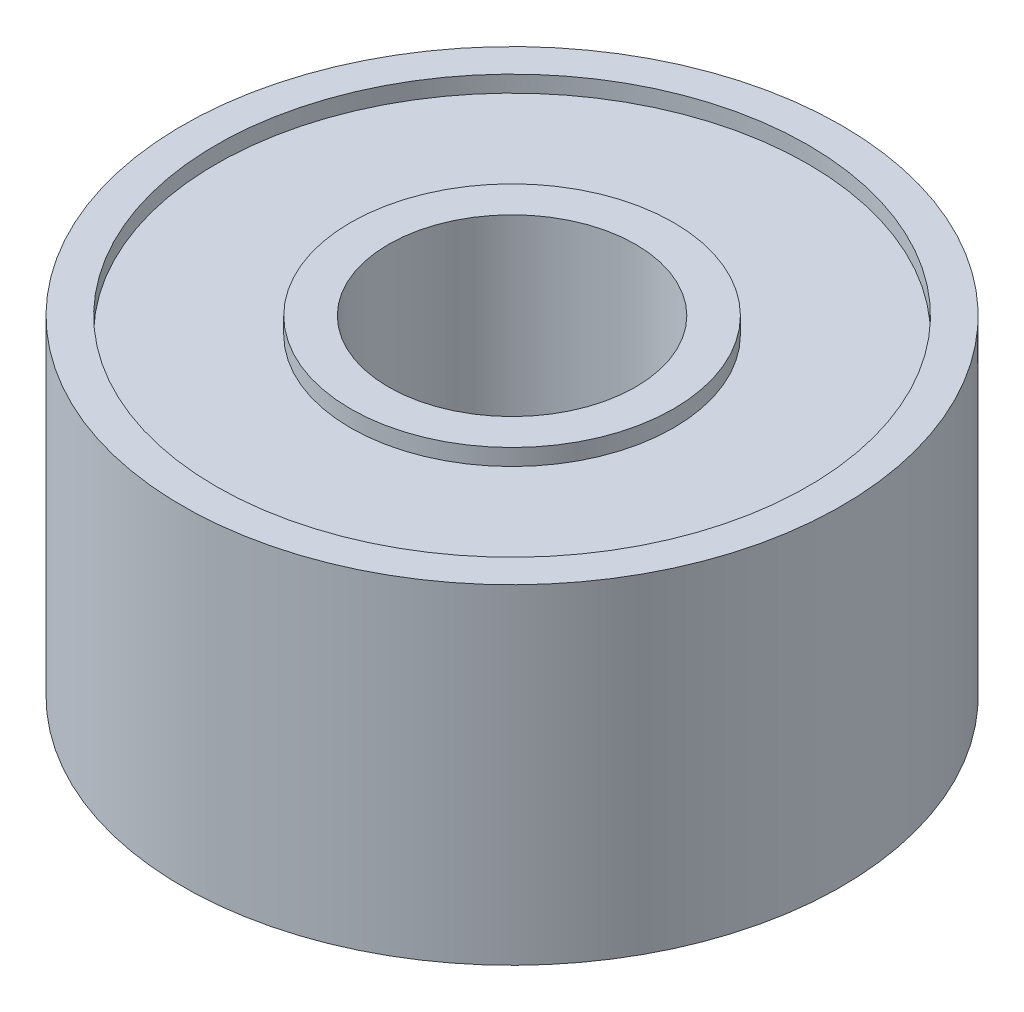
ISO-10303-21;
HEADER;
FILE_DESCRIPTION(('STEP AP214'),'2;1');
FILE_NAME('part.step','',(''),(''),'','','');
FILE_SCHEMA(('AUTOMOTIVE_DESIGN { 1 0 10303 214 1 1 1 1 }'));
ENDSEC;
DATA;
#1=APPLICATION_CONTEXT('core data for automotive mechanical design processes');
#2=APPLICATION_PROTOCOL_DEFINITION('international standard','automotive_design',2000,#1);
#3=PRODUCT_CONTEXT('',#1,'mechanical');
#4=PRODUCT('Part','Part','',(#3));
#5=PRODUCT_RELATED_PRODUCT_CATEGORY('part','',(#4));
#6=PRODUCT_DEFINITION_FORMATION('','',#4);
#7=PRODUCT_DEFINITION_CONTEXT('part definition',#1,'design');
#8=PRODUCT_DEFINITION('design','',#6,#7);
#9=PRODUCT_DEFINITION_SHAPE('','',#8);
#10=(LENGTH_UNIT() NAMED_UNIT(*) SI_UNIT(.MILLI.,.METRE.));
#11=(NAMED_UNIT(*) PLANE_ANGLE_UNIT() SI_UNIT($,.RADIAN.));
#12=(NAMED_UNIT(*) SI_UNIT($,.STERADIAN.) SOLID_ANGLE_UNIT());
#13=UNCERTAINTY_MEASURE_WITH_UNIT(LENGTH_MEASURE(1.E-05),#10,'distance_accuracy_value','');
#14=(GEOMETRIC_REPRESENTATION_CONTEXT(3) GLOBAL_UNCERTAINTY_ASSIGNED_CONTEXT((#13)) GLOBAL_UNIT_ASSIGNED_CONTEXT((#10,
#11,#12)) REPRESENTATION_CONTEXT('',''));
#15=CARTESIAN_POINT('',(0.,0.,0.));
#16=DIRECTION('',(0.,0.,1.));
#17=DIRECTION('',(1.,0.,0.));
#18=AXIS2_PLACEMENT_3D('',#15,#16,#17);
#19=CARTESIAN_POINT('',(0.,0.,0.));
#20=DIRECTION('',(0.,0.999999999999995,0.));
#21=DIRECTION('',(0.,0.,0.999999999999995));
#22=AXIS2_PLACEMENT_3D('',#19,#20,#21);
#23=PLANE('',#22);
#24=CARTESIAN_POINT('',(0.,0.,0.));
#25=DIRECTION('',(0.,0.999999999999995,0.));
#26=DIRECTION('',(0.,0.,0.999999999999995));
#27=AXIS2_PLACEMENT_3D('',#24,#25,#26);
#28=CIRCLE('',#27,1.5);
#29=CARTESIAN_POINT('',(0.,0.,-1.49999999999999));
#30=VERTEX_POINT('',#29);
#31=EDGE_CURVE('E45',#30,#30,#28,.T.);
#32=ORIENTED_EDGE('',*,*,#31,.T.);
#33=EDGE_LOOP('',(#32));
#34=FACE_BOUND('',#33,.T.);
#35=CARTESIAN_POINT('',(0.,0.,0.));
#36=DIRECTION('',(0.,-0.999999999999995,0.));
#37=DIRECTION('',(0.,0.,-0.999999999999995));
#38=AXIS2_PLACEMENT_3D('',#35,#36,#37);
#39=CIRCLE('',#38,1.94339327485534);
#40=CARTESIAN_POINT('',(0.,0.,-1.94339327485533));
#41=VERTEX_POINT('',#40);
#42=EDGE_CURVE('E69',#41,#41,#39,.T.);
#43=ORIENTED_EDGE('',*,*,#42,.T.);
#44=EDGE_LOOP('',(#43));
#45=FACE_BOUND('',#44,.T.);
#46=ADVANCED_FACE('F32',(#34,#45),#23,.F.);
#47=CARTESIAN_POINT('',(0.,4.,0.));
#48=DIRECTION('',(0.,0.999999999999995,0.));
#49=DIRECTION('',(0.,0.,0.999999999999995));
#50=AXIS2_PLACEMENT_3D('',#47,#48,#49);
#51=PLANE('',#50);
#52=CARTESIAN_POINT('',(0.,4.,0.));
#53=DIRECTION('',(0.,0.999999999999995,0.));
#54=DIRECTION('',(0.,0.,0.999999999999995));
#55=AXIS2_PLACEMENT_3D('',#52,#53,#54);
#56=CIRCLE('',#55,1.5);
#57=CARTESIAN_POINT('',(0.,4.,-1.49999999999999));
#58=VERTEX_POINT('',#57);
#59=EDGE_CURVE('E43',#58,#58,#56,.T.);
#60=ORIENTED_EDGE('',*,*,#59,.F.);
#61=EDGE_LOOP('',(#60));
#62=FACE_BOUND('',#61,.T.);
#63=CARTESIAN_POINT('',(0.,4.,0.));
#64=DIRECTION('',(0.,0.999999999999995,0.));
#65=DIRECTION('',(0.,0.,0.999999999999995));
#66=AXIS2_PLACEMENT_3D('',#63,#64,#65);
#67=CIRCLE('',#66,1.95973775323566);
#68=CARTESIAN_POINT('',(0.,4.,1.95973775323565));
#69=VERTEX_POINT('',#68);
#70=EDGE_CURVE('E57',#69,#69,#67,.T.);
#71=ORIENTED_EDGE('',*,*,#70,.T.);
#72=EDGE_LOOP('',(#71));
#73=FACE_BOUND('',#72,.T.);
#74=ADVANCED_FACE('F107',(#62,#73),#51,.T.);
#75=CARTESIAN_POINT('',(0.,4.,0.));
#76=DIRECTION('',(0.,0.999999999999995,0.));
#77=DIRECTION('',(0.,0.,0.999999999999995));
#78=AXIS2_PLACEMENT_3D('',#75,#76,#77);
#79=CIRCLE('',#78,3.59090513639436);
#80=CARTESIAN_POINT('',(0.,4.,3.59090513639434));
#81=VERTEX_POINT('',#80);
#82=EDGE_CURVE('E51',#81,#81,#79,.T.);
#83=ORIENTED_EDGE('',*,*,#82,.F.);
#84=EDGE_LOOP('',(#83));
#85=FACE_BOUND('',#84,.T.);
#86=CARTESIAN_POINT('',(0.,4.,0.));
#87=DIRECTION('',(0.,0.999999999999995,0.));
#88=DIRECTION('',(0.,0.,0.999999999999995));
#89=AXIS2_PLACEMENT_3D('',#86,#87,#88);
#90=CIRCLE('',#89,4.);
#91=CARTESIAN_POINT('',(0.,4.,-3.99999999999998));
#92=VERTEX_POINT('',#91);
#93=EDGE_CURVE('E10',#92,#92,#90,.T.);
#94=ORIENTED_EDGE('',*,*,#93,.T.);
#95=EDGE_LOOP('',(#94));
#96=FACE_BOUND('',#95,.T.);
#97=ADVANCED_FACE('F94',(#85,#96),#51,.T.);
#98=CARTESIAN_POINT('',(0.,0.,0.));
#99=DIRECTION('',(0.,-0.999999999999995,0.));
#100=DIRECTION('',(0.,0.,-0.999999999999995));
#101=AXIS2_PLACEMENT_3D('',#98,#99,#100);
#102=CIRCLE('',#101,3.59090513639436);
#103=CARTESIAN_POINT('',(0.,0.,-3.59090513639434));
#104=VERTEX_POINT('',#103);
#105=EDGE_CURVE('E63',#104,#104,#102,.T.);
#106=ORIENTED_EDGE('',*,*,#105,.F.);
#107=EDGE_LOOP('',(#106));
#108=FACE_BOUND('',#107,.T.);
#109=CARTESIAN_POINT('',(0.,0.,0.));
#110=DIRECTION('',(0.,0.999999999999995,0.));
#111=DIRECTION('',(0.,0.,0.999999999999995));
#112=AXIS2_PLACEMENT_3D('',#109,#110,#111);
#113=CIRCLE('',#112,4.);
#114=CARTESIAN_POINT('',(0.,0.,-3.99999999999998));
#115=VERTEX_POINT('',#114);
#116=EDGE_CURVE('E36',#115,#115,#113,.T.);
#117=ORIENTED_EDGE('',*,*,#116,.F.);
#118=EDGE_LOOP('',(#117));
#119=FACE_BOUND('',#118,.T.);
#120=ADVANCED_FACE('F91',(#108,#119),#23,.F.);
#121=CARTESIAN_POINT('',(0.,4.,0.));
#122=DIRECTION('',(0.,-0.999999999999995,0.));
#123=DIRECTION('',(0.,0.,-0.999999999999995));
#124=AXIS2_PLACEMENT_3D('',#121,#122,#123);
#125=CYLINDRICAL_SURFACE('',#124,4.);
#126=CARTESIAN_POINT('',(0.,4.,-3.99999999999998));
#127=CARTESIAN_POINT('',(0.,3.95833333333334,-3.99999999999998));
#128=CARTESIAN_POINT('',(0.,3.91666666666667,-3.99999999999998));
#129=CARTESIAN_POINT('',(0.,3.83333333333334,-3.99999999999998));
#130=CARTESIAN_POINT('',(0.,3.79166666666667,-3.99999999999998));
#131=CARTESIAN_POINT('',(0.,3.70833333333334,-3.99999999999998));
#132=CARTESIAN_POINT('',(0.,3.66666666666667,-3.99999999999998));
#133=CARTESIAN_POINT('',(0.,3.58333333333334,-3.99999999999998));
#134=CARTESIAN_POINT('',(0.,3.54166666666667,-3.99999999999998));
#135=CARTESIAN_POINT('',(0.,3.45833333333334,-3.99999999999998));
#136=CARTESIAN_POINT('',(0.,3.41666666666667,-3.99999999999998));
#137=CARTESIAN_POINT('',(0.,3.33333333333334,-3.99999999999998));
#138=CARTESIAN_POINT('',(0.,3.29166666666667,-3.99999999999998));
#139=CARTESIAN_POINT('',(0.,3.20833333333334,-3.99999999999998));
#140=CARTESIAN_POINT('',(0.,3.16666666666667,-3.99999999999998));
#141=CARTESIAN_POINT('',(0.,3.08333333333334,-3.99999999999998));
#142=CARTESIAN_POINT('',(0.,3.04166666666667,-3.99999999999998));
#143=CARTESIAN_POINT('',(0.,2.95833333333334,-3.99999999999998));
#144=CARTESIAN_POINT('',(0.,2.91666666666667,-3.99999999999998));
#145=CARTESIAN_POINT('',(0.,2.83333333333334,-3.99999999999998));
#146=CARTESIAN_POINT('',(0.,2.79166666666667,-3.99999999999998));
#147=CARTESIAN_POINT('',(0.,2.70833333333334,-3.99999999999998));
#148=CARTESIAN_POINT('',(0.,2.66666666666667,-3.99999999999998));
#149=CARTESIAN_POINT('',(0.,2.58333333333334,-3.99999999999998));
#150=CARTESIAN_POINT('',(0.,2.54166666666667,-3.99999999999998));
#151=CARTESIAN_POINT('',(0.,2.45833333333333,-3.99999999999998));
#152=CARTESIAN_POINT('',(0.,2.41666666666667,-3.99999999999998));
#153=CARTESIAN_POINT('',(0.,2.33333333333333,-3.99999999999998));
#154=CARTESIAN_POINT('',(0.,2.29166666666667,-3.99999999999998));
#155=CARTESIAN_POINT('',(0.,2.20833333333333,-3.99999999999998));
#156=CARTESIAN_POINT('',(0.,2.16666666666667,-3.99999999999998));
#157=CARTESIAN_POINT('',(0.,2.08333333333333,-3.99999999999998));
#158=CARTESIAN_POINT('',(0.,2.04166666666667,-3.99999999999998));
#159=CARTESIAN_POINT('',(0.,1.95833333333333,-3.99999999999998));
#160=CARTESIAN_POINT('',(0.,1.91666666666667,-3.99999999999998));
#161=CARTESIAN_POINT('',(0.,1.83333333333333,-3.99999999999998));
#162=CARTESIAN_POINT('',(0.,1.79166666666667,-3.99999999999998));
#163=CARTESIAN_POINT('',(0.,1.70833333333333,-3.99999999999998));
#164=CARTESIAN_POINT('',(0.,1.66666666666667,-3.99999999999998));
#165=CARTESIAN_POINT('',(0.,1.58333333333333,-3.99999999999998));
#166=CARTESIAN_POINT('',(0.,1.54166666666667,-3.99999999999998));
#167=CARTESIAN_POINT('',(0.,1.45833333333333,-3.99999999999998));
#168=CARTESIAN_POINT('',(0.,1.41666666666667,-3.99999999999998));
#169=CARTESIAN_POINT('',(0.,1.33333333333333,-3.99999999999998));
#170=CARTESIAN_POINT('',(0.,1.29166666666667,-3.99999999999998));
#171=CARTESIAN_POINT('',(0.,1.20833333333333,-3.99999999999998));
#172=CARTESIAN_POINT('',(0.,1.16666666666667,-3.99999999999998));
#173=CARTESIAN_POINT('',(0.,1.08333333333333,-3.99999999999998));
#174=CARTESIAN_POINT('',(0.,1.04166666666667,-3.99999999999998));
#175=CARTESIAN_POINT('',(0.,0.958333333333333,-3.99999999999998));
#176=CARTESIAN_POINT('',(0.,0.916666666666667,-3.99999999999998));
#177=CARTESIAN_POINT('',(0.,0.833333333333333,-3.99999999999998));
#178=CARTESIAN_POINT('',(0.,0.791666666666667,-3.99999999999998));
#179=CARTESIAN_POINT('',(0.,0.708333333333333,-3.99999999999998));
#180=CARTESIAN_POINT('',(0.,0.666666666666666,-3.99999999999998));
#181=CARTESIAN_POINT('',(0.,0.583333333333333,-3.99999999999998));
#182=CARTESIAN_POINT('',(0.,0.541666666666666,-3.99999999999998));
#183=CARTESIAN_POINT('',(0.,0.458333333333333,-3.99999999999998));
#184=CARTESIAN_POINT('',(0.,0.416666666666666,-3.99999999999998));
#185=CARTESIAN_POINT('',(0.,0.333333333333333,-3.99999999999998));
#186=CARTESIAN_POINT('',(0.,0.291666666666666,-3.99999999999998));
#187=CARTESIAN_POINT('',(0.,0.208333333333333,-3.99999999999998));
#188=CARTESIAN_POINT('',(0.,0.166666666666666,-3.99999999999998));
#189=CARTESIAN_POINT('',(0.,0.0833333333333328,-3.99999999999998));
#190=CARTESIAN_POINT('',(0.,0.041666666666666,-3.99999999999998));
#191=CARTESIAN_POINT('',(0.,0.,-3.99999999999998));
#192=B_SPLINE_CURVE_WITH_KNOTS('',3,(#126,#127,#128,#129,#130,#131,#132,#133,#134,#135,#136,
#137,#138,#139,#140,#141,#142,#143,#144,#145,#146,#147,#148,#149,#150,#151,#152,#153,#154,#155,
#156,#157,#158,#159,#160,#161,#162,#163,#164,#165,#166,#167,#168,#169,#170,#171,#172,#173,#174,
#175,#176,#177,#178,#179,#180,#181,#182,#183,#184,#185,#186,#187,#188,#189,#190,#191),
.UNSPECIFIED.,.F.,.F.,(4,2,2,2,2,2,2,2,2,2,2,2,2,2,2,2,2,2,2,2,2,2,2,2,2,2,2,2,2,2,2,2,4),(0.,
0.125,0.25,0.375,0.5,0.625,0.75,0.875,1.,1.125,1.25,1.375,1.5,1.625,1.75,1.875,2.,2.125,2.25,
2.375,2.5,2.625,2.75,2.875,3.,3.125,3.25,3.375,3.5,3.625,3.75,3.875,4.),.UNSPECIFIED.);
#193=EDGE_CURVE('BSEAM34',#92,#115,#192,.T.);
#194=ORIENTED_EDGE('',*,*,#93,.F.);
#195=ORIENTED_EDGE('',*,*,#116,.T.);
#196=ORIENTED_EDGE('',*,*,#193,.T.);
#197=ORIENTED_EDGE('',*,*,#193,.F.);
#198=EDGE_LOOP('',(#194,#196,#195,#197));
#199=FACE_BOUND('',#198,.T.);
#200=ADVANCED_FACE('F34',(#199),#125,.T.);
#201=CARTESIAN_POINT('',(0.,4.,0.));
#202=DIRECTION('',(0.,-0.999999999999995,0.));
#203=DIRECTION('',(0.,0.,-0.999999999999995));
#204=AXIS2_PLACEMENT_3D('',#201,#202,#203);
#205=CYLINDRICAL_SURFACE('',#204,1.5);
#206=CARTESIAN_POINT('',(0.,4.,-1.49999999999999));
#207=CARTESIAN_POINT('',(0.,3.95833333333334,-1.49999999999999));
#208=CARTESIAN_POINT('',(0.,3.91666666666667,-1.49999999999999));
#209=CARTESIAN_POINT('',(0.,3.83333333333334,-1.49999999999999));
#210=CARTESIAN_POINT('',(0.,3.79166666666667,-1.49999999999999));
#211=CARTESIAN_POINT('',(0.,3.70833333333334,-1.49999999999999));
#212=CARTESIAN_POINT('',(0.,3.66666666666667,-1.49999999999999));
#213=CARTESIAN_POINT('',(0.,3.58333333333334,-1.49999999999999));
#214=CARTESIAN_POINT('',(0.,3.54166666666667,-1.49999999999999));
#215=CARTESIAN_POINT('',(0.,3.45833333333334,-1.49999999999999));
#216=CARTESIAN_POINT('',(0.,3.41666666666667,-1.49999999999999));
#217=CARTESIAN_POINT('',(0.,3.33333333333334,-1.49999999999999));
#218=CARTESIAN_POINT('',(0.,3.29166666666667,-1.49999999999999));
#219=CARTESIAN_POINT('',(0.,3.20833333333334,-1.49999999999999));
#220=CARTESIAN_POINT('',(0.,3.16666666666667,-1.49999999999999));
#221=CARTESIAN_POINT('',(0.,3.08333333333334,-1.49999999999999));
#222=CARTESIAN_POINT('',(0.,3.04166666666667,-1.49999999999999));
#223=CARTESIAN_POINT('',(0.,2.95833333333333,-1.49999999999999));
#224=CARTESIAN_POINT('',(0.,2.91666666666667,-1.49999999999999));
#225=CARTESIAN_POINT('',(0.,2.83333333333333,-1.49999999999999));
#226=CARTESIAN_POINT('',(0.,2.79166666666667,-1.49999999999999));
#227=CARTESIAN_POINT('',(0.,2.70833333333333,-1.49999999999999));
#228=CARTESIAN_POINT('',(0.,2.66666666666667,-1.49999999999999));
#229=CARTESIAN_POINT('',(0.,2.58333333333333,-1.49999999999999));
#230=CARTESIAN_POINT('',(0.,2.54166666666667,-1.49999999999999));
#231=CARTESIAN_POINT('',(0.,2.45833333333333,-1.49999999999999));
#232=CARTESIAN_POINT('',(0.,2.41666666666667,-1.49999999999999));
#233=CARTESIAN_POINT('',(0.,2.33333333333333,-1.49999999999999));
#234=CARTESIAN_POINT('',(0.,2.29166666666667,-1.49999999999999));
#235=CARTESIAN_POINT('',(0.,2.20833333333333,-1.49999999999999));
#236=CARTESIAN_POINT('',(0.,2.16666666666667,-1.49999999999999));
#237=CARTESIAN_POINT('',(0.,2.08333333333333,-1.49999999999999));
#238=CARTESIAN_POINT('',(0.,2.04166666666667,-1.49999999999999));
#239=CARTESIAN_POINT('',(0.,1.95833333333333,-1.49999999999999));
#240=CARTESIAN_POINT('',(0.,1.91666666666667,-1.49999999999999));
#241=CARTESIAN_POINT('',(0.,1.83333333333333,-1.49999999999999));
#242=CARTESIAN_POINT('',(0.,1.79166666666667,-1.49999999999999));
#243=CARTESIAN_POINT('',(0.,1.70833333333333,-1.49999999999999));
#244=CARTESIAN_POINT('',(0.,1.66666666666667,-1.49999999999999));
#245=CARTESIAN_POINT('',(0.,1.58333333333333,-1.49999999999999));
#246=CARTESIAN_POINT('',(0.,1.54166666666667,-1.49999999999999));
#247=CARTESIAN_POINT('',(0.,1.45833333333333,-1.49999999999999));
#248=CARTESIAN_POINT('',(0.,1.41666666666667,-1.49999999999999));
#249=CARTESIAN_POINT('',(0.,1.33333333333333,-1.49999999999999));
#250=CARTESIAN_POINT('',(0.,1.29166666666667,-1.49999999999999));
#251=CARTESIAN_POINT('',(0.,1.20833333333333,-1.49999999999999));
#252=CARTESIAN_POINT('',(0.,1.16666666666667,-1.49999999999999));
#253=CARTESIAN_POINT('',(0.,1.08333333333333,-1.49999999999999));
#254=CARTESIAN_POINT('',(0.,1.04166666666667,-1.49999999999999));
#255=CARTESIAN_POINT('',(0.,0.958333333333333,-1.49999999999999));
#256=CARTESIAN_POINT('',(0.,0.916666666666666,-1.49999999999999));
#257=CARTESIAN_POINT('',(0.,0.833333333333332,-1.49999999999999));
#258=CARTESIAN_POINT('',(0.,0.791666666666666,-1.49999999999999));
#259=CARTESIAN_POINT('',(0.,0.708333333333332,-1.49999999999999));
#260=CARTESIAN_POINT('',(0.,0.666666666666666,-1.49999999999999));
#261=CARTESIAN_POINT('',(0.,0.583333333333332,-1.49999999999999));
#262=CARTESIAN_POINT('',(0.,0.541666666666665,-1.49999999999999));
#263=CARTESIAN_POINT('',(0.,0.458333333333332,-1.49999999999999));
#264=CARTESIAN_POINT('',(0.,0.416666666666666,-1.49999999999999));
#265=CARTESIAN_POINT('',(0.,0.333333333333332,-1.49999999999999));
#266=CARTESIAN_POINT('',(0.,0.291666666666665,-1.49999999999999));
#267=CARTESIAN_POINT('',(0.,0.208333333333332,-1.49999999999999));
#268=CARTESIAN_POINT('',(0.,0.166666666666665,-1.49999999999999));
#269=CARTESIAN_POINT('',(0.,0.0833333333333323,-1.49999999999999));
#270=CARTESIAN_POINT('',(0.,0.0416666666666657,-1.49999999999999));
#271=CARTESIAN_POINT('',(0.,0.,-1.49999999999999));
#272=B_SPLINE_CURVE_WITH_KNOTS('',3,(#206,#207,#208,#209,#210,#211,#212,#213,#214,#215,#216,
#217,#218,#219,#220,#221,#222,#223,#224,#225,#226,#227,#228,#229,#230,#231,#232,#233,#234,#235,
#236,#237,#238,#239,#240,#241,#242,#243,#244,#245,#246,#247,#248,#249,#250,#251,#252,#253,#254,
#255,#256,#257,#258,#259,#260,#261,#262,#263,#264,#265,#266,#267,#268,#269,#270,#271),
.UNSPECIFIED.,.F.,.F.,(4,2,2,2,2,2,2,2,2,2,2,2,2,2,2,2,2,2,2,2,2,2,2,2,2,2,2,2,2,2,2,2,4),(0.,
0.125000000000001,0.250000000000001,0.375000000000001,0.500000000000001,0.625000000000001,
0.750000000000002,0.875000000000002,1.,1.125,1.25,1.375,1.5,1.625,1.75,1.875,2.,2.125,2.25,
2.375,2.5,2.625,2.75,2.875,3.,3.125,3.25,3.375,3.5,3.625,3.75,3.875,4.),.UNSPECIFIED.);
#273=EDGE_CURVE('BSEAM98',#58,#30,#272,.T.);
#274=ORIENTED_EDGE('',*,*,#59,.T.);
#275=ORIENTED_EDGE('',*,*,#31,.F.);
#276=ORIENTED_EDGE('',*,*,#273,.T.);
#277=ORIENTED_EDGE('',*,*,#273,.F.);
#278=EDGE_LOOP('',(#274,#276,#275,#277));
#279=FACE_BOUND('',#278,.T.);
#280=ADVANCED_FACE('F98',(#279),#205,.F.);
#281=CARTESIAN_POINT('',(0.,3.80000000000003,0.));
#282=DIRECTION('',(0.,0.999999999999995,0.));
#283=DIRECTION('',(0.,0.,0.999999999999995));
#284=AXIS2_PLACEMENT_3D('',#281,#282,#283);
#285=CYLINDRICAL_SURFACE('',#284,3.59090513639436);
#286=CARTESIAN_POINT('',(0.,3.80000000000003,0.));
#287=DIRECTION('',(0.,0.999999999999995,0.));
#288=DIRECTION('',(0.,0.,0.999999999999995));
#289=AXIS2_PLACEMENT_3D('',#286,#287,#288);
#290=CIRCLE('',#289,3.59090513639436);
#291=CARTESIAN_POINT('',(0.,3.80000000000003,3.59090513639434));
#292=VERTEX_POINT('',#291);
#293=EDGE_CURVE('E48',#292,#292,#290,.T.);
#294=CARTESIAN_POINT('',(0.,3.80000000000003,3.59090513639434));
#295=CARTESIAN_POINT('',(0.,3.80208333333336,3.59090513639434));
#296=CARTESIAN_POINT('',(0.,3.80416666666669,3.59090513639434));
#297=CARTESIAN_POINT('',(0.,3.80833333333336,3.59090513639434));
#298=CARTESIAN_POINT('',(0.,3.81041666666669,3.59090513639434));
#299=CARTESIAN_POINT('',(0.,3.81458333333336,3.59090513639434));
#300=CARTESIAN_POINT('',(0.,3.81666666666669,3.59090513639434));
#301=CARTESIAN_POINT('',(0.,3.82083333333336,3.59090513639434));
#302=CARTESIAN_POINT('',(0.,3.82291666666669,3.59090513639434));
#303=CARTESIAN_POINT('',(0.,3.82708333333336,3.59090513639434));
#304=CARTESIAN_POINT('',(0.,3.82916666666669,3.59090513639434));
#305=CARTESIAN_POINT('',(0.,3.83333333333336,3.59090513639434));
#306=CARTESIAN_POINT('',(0.,3.83541666666669,3.59090513639434));
#307=CARTESIAN_POINT('',(0.,3.83958333333335,3.59090513639434));
#308=CARTESIAN_POINT('',(0.,3.84166666666669,3.59090513639434));
#309=CARTESIAN_POINT('',(0.,3.84583333333335,3.59090513639434));
#310=CARTESIAN_POINT('',(0.,3.84791666666669,3.59090513639434));
#311=CARTESIAN_POINT('',(0.,3.85208333333335,3.59090513639434));
#312=CARTESIAN_POINT('',(0.,3.85416666666669,3.59090513639434));
#313=CARTESIAN_POINT('',(0.,3.85833333333335,3.59090513639434));
#314=CARTESIAN_POINT('',(0.,3.86041666666669,3.59090513639434));
#315=CARTESIAN_POINT('',(0.,3.86458333333335,3.59090513639434));
#316=CARTESIAN_POINT('',(0.,3.86666666666669,3.59090513639434));
#317=CARTESIAN_POINT('',(0.,3.87083333333335,3.59090513639434));
#318=CARTESIAN_POINT('',(0.,3.87291666666668,3.59090513639434));
#319=CARTESIAN_POINT('',(0.,3.87708333333335,3.59090513639434));
#320=CARTESIAN_POINT('',(0.,3.87916666666668,3.59090513639434));
#321=CARTESIAN_POINT('',(0.,3.88333333333335,3.59090513639434));
#322=CARTESIAN_POINT('',(0.,3.88541666666668,3.59090513639434));
#323=CARTESIAN_POINT('',(0.,3.88958333333335,3.59090513639434));
#324=CARTESIAN_POINT('',(0.,3.89166666666668,3.59090513639434));
#325=CARTESIAN_POINT('',(0.,3.89583333333335,3.59090513639434));
#326=CARTESIAN_POINT('',(0.,3.89791666666668,3.59090513639434));
#327=CARTESIAN_POINT('',(0.,3.90208333333335,3.59090513639434));
#328=CARTESIAN_POINT('',(0.,3.90416666666668,3.59090513639434));
#329=CARTESIAN_POINT('',(0.,3.90833333333335,3.59090513639434));
#330=CARTESIAN_POINT('',(0.,3.91041666666668,3.59090513639434));
#331=CARTESIAN_POINT('',(0.,3.91458333333335,3.59090513639434));
#332=CARTESIAN_POINT('',(0.,3.91666666666668,3.59090513639434));
#333=CARTESIAN_POINT('',(0.,3.92083333333335,3.59090513639434));
#334=CARTESIAN_POINT('',(0.,3.92291666666668,3.59090513639434));
#335=CARTESIAN_POINT('',(0.,3.92708333333335,3.59090513639434));
#336=CARTESIAN_POINT('',(0.,3.92916666666668,3.59090513639434));
#337=CARTESIAN_POINT('',(0.,3.93333333333334,3.59090513639434));
#338=CARTESIAN_POINT('',(0.,3.93541666666668,3.59090513639434));
#339=CARTESIAN_POINT('',(0.,3.93958333333334,3.59090513639434));
#340=CARTESIAN_POINT('',(0.,3.94166666666668,3.59090513639434));
#341=CARTESIAN_POINT('',(0.,3.94583333333334,3.59090513639434));
#342=CARTESIAN_POINT('',(0.,3.94791666666668,3.59090513639434));
#343=CARTESIAN_POINT('',(0.,3.95208333333334,3.59090513639434));
#344=CARTESIAN_POINT('',(0.,3.95416666666668,3.59090513639434));
#345=CARTESIAN_POINT('',(0.,3.95833333333334,3.59090513639434));
#346=CARTESIAN_POINT('',(0.,3.96041666666667,3.59090513639434));
#347=CARTESIAN_POINT('',(0.,3.96458333333334,3.59090513639434));
#348=CARTESIAN_POINT('',(0.,3.96666666666667,3.59090513639434));
#349=CARTESIAN_POINT('',(0.,3.97083333333334,3.59090513639434));
#350=CARTESIAN_POINT('',(0.,3.97291666666667,3.59090513639434));
#351=CARTESIAN_POINT('',(0.,3.97708333333334,3.59090513639434));
#352=CARTESIAN_POINT('',(0.,3.97916666666667,3.59090513639434));
#353=CARTESIAN_POINT('',(0.,3.98333333333334,3.59090513639434));
#354=CARTESIAN_POINT('',(0.,3.98541666666667,3.59090513639434));
#355=CARTESIAN_POINT('',(0.,3.98958333333334,3.59090513639434));
#356=CARTESIAN_POINT('',(0.,3.99166666666667,3.59090513639434));
#357=CARTESIAN_POINT('',(0.,3.99583333333334,3.59090513639434));
#358=CARTESIAN_POINT('',(0.,3.99791666666667,3.59090513639434));
#359=CARTESIAN_POINT('',(0.,4.,3.59090513639434));
#360=B_SPLINE_CURVE_WITH_KNOTS('',3,(#294,#295,#296,#297,#298,#299,#300,#301,#302,#303,#304,
#305,#306,#307,#308,#309,#310,#311,#312,#313,#314,#315,#316,#317,#318,#319,#320,#321,#322,#323,
#324,#325,#326,#327,#328,#329,#330,#331,#332,#333,#334,#335,#336,#337,#338,#339,#340,#341,#342,
#343,#344,#345,#346,#347,#348,#349,#350,#351,#352,#353,#354,#355,#356,#357,#358,#359),
.UNSPECIFIED.,.F.,.F.,(4,2,2,2,2,2,2,2,2,2,2,2,2,2,2,2,2,2,2,2,2,2,2,2,2,2,2,2,2,2,2,2,4),(0.,
0.00624999999999931,0.0124999999999986,0.0187499999999979,0.0249999999999972,0.0312499999999966,
0.0374999999999959,0.0437499999999952,0.0499999999999945,0.0562499999999938,0.0624999999999931,
0.0687499999999924,0.0749999999999917,0.0812499999999911,0.0874999999999904,0.0937499999999897,
0.099999999999989,0.106249999999988,0.112499999999987,0.118749999999986,0.124999999999986,
0.131249999999985,0.137499999999984,0.143749999999984,0.149999999999983,0.156249999999982,
0.162499999999982,0.168749999999981,0.17499999999998,0.18124999999998,0.187499999999979,
0.193749999999978,0.199999999999978),.UNSPECIFIED.);
#361=EDGE_CURVE('BSEAM103',#292,#81,#360,.T.);
#362=ORIENTED_EDGE('',*,*,#293,.F.);
#363=ORIENTED_EDGE('',*,*,#82,.T.);
#364=ORIENTED_EDGE('',*,*,#361,.T.);
#365=ORIENTED_EDGE('',*,*,#361,.F.);
#366=EDGE_LOOP('',(#362,#364,#363,#365));
#367=FACE_BOUND('',#366,.T.);
#368=ADVANCED_FACE('F103',(#367),#285,.F.);
#369=CARTESIAN_POINT('',(0.,3.80000000000003,0.));
#370=DIRECTION('',(0.,0.999999999999995,0.));
#371=DIRECTION('',(0.,0.,0.999999999999995));
#372=AXIS2_PLACEMENT_3D('',#369,#370,#371);
#373=PLANE('',#372);
#374=CARTESIAN_POINT('',(0.,3.80000000000003,0.));
#375=DIRECTION('',(0.,0.999999999999995,0.));
#376=DIRECTION('',(0.,0.,0.999999999999995));
#377=AXIS2_PLACEMENT_3D('',#374,#375,#376);
#378=CIRCLE('',#377,1.95973775323566);
#379=CARTESIAN_POINT('',(0.,3.80000000000003,1.95973775323565));
#380=VERTEX_POINT('',#379);
#381=EDGE_CURVE('E54',#380,#380,#378,.T.);
#382=ORIENTED_EDGE('',*,*,#381,.F.);
#383=EDGE_LOOP('',(#382));
#384=FACE_BOUND('',#383,.T.);
#385=ORIENTED_EDGE('',*,*,#293,.T.);
#386=EDGE_LOOP('',(#385));
#387=FACE_BOUND('',#386,.T.);
#388=ADVANCED_FACE('F120',(#384,#387),#373,.T.);
#389=CARTESIAN_POINT('',(0.,3.80000000000003,0.));
#390=DIRECTION('',(0.,0.999999999999995,0.));
#391=DIRECTION('',(0.,0.,0.999999999999995));
#392=AXIS2_PLACEMENT_3D('',#389,#390,#391);
#393=CYLINDRICAL_SURFACE('',#392,1.95973775323566);
#394=CARTESIAN_POINT('',(0.,3.80000000000003,1.95973775323565));
#395=CARTESIAN_POINT('',(0.,3.80208333333336,1.95973775323565));
#396=CARTESIAN_POINT('',(0.,3.80416666666669,1.95973775323565));
#397=CARTESIAN_POINT('',(0.,3.80833333333336,1.95973775323565));
#398=CARTESIAN_POINT('',(0.,3.81041666666669,1.95973775323565));
#399=CARTESIAN_POINT('',(0.,3.81458333333336,1.95973775323565));
#400=CARTESIAN_POINT('',(0.,3.81666666666669,1.95973775323565));
#401=CARTESIAN_POINT('',(0.,3.82083333333336,1.95973775323565));
#402=CARTESIAN_POINT('',(0.,3.82291666666669,1.95973775323565));
#403=CARTESIAN_POINT('',(0.,3.82708333333336,1.95973775323565));
#404=CARTESIAN_POINT('',(0.,3.82916666666669,1.95973775323565));
#405=CARTESIAN_POINT('',(0.,3.83333333333336,1.95973775323565));
#406=CARTESIAN_POINT('',(0.,3.83541666666669,1.95973775323565));
#407=CARTESIAN_POINT('',(0.,3.83958333333335,1.95973775323565));
#408=CARTESIAN_POINT('',(0.,3.84166666666669,1.95973775323565));
#409=CARTESIAN_POINT('',(0.,3.84583333333335,1.95973775323565));
#410=CARTESIAN_POINT('',(0.,3.84791666666669,1.95973775323565));
#411=CARTESIAN_POINT('',(0.,3.85208333333335,1.95973775323565));
#412=CARTESIAN_POINT('',(0.,3.85416666666669,1.95973775323565));
#413=CARTESIAN_POINT('',(0.,3.85833333333335,1.95973775323565));
#414=CARTESIAN_POINT('',(0.,3.86041666666669,1.95973775323565));
#415=CARTESIAN_POINT('',(0.,3.86458333333335,1.95973775323565));
#416=CARTESIAN_POINT('',(0.,3.86666666666669,1.95973775323565));
#417=CARTESIAN_POINT('',(0.,3.87083333333335,1.95973775323565));
#418=CARTESIAN_POINT('',(0.,3.87291666666668,1.95973775323565));
#419=CARTESIAN_POINT('',(0.,3.87708333333335,1.95973775323565));
#420=CARTESIAN_POINT('',(0.,3.87916666666668,1.95973775323565));
#421=CARTESIAN_POINT('',(0.,3.88333333333335,1.95973775323565));
#422=CARTESIAN_POINT('',(0.,3.88541666666668,1.95973775323565));
#423=CARTESIAN_POINT('',(0.,3.88958333333335,1.95973775323565));
#424=CARTESIAN_POINT('',(0.,3.89166666666668,1.95973775323565));
#425=CARTESIAN_POINT('',(0.,3.89583333333335,1.95973775323565));
#426=CARTESIAN_POINT('',(0.,3.89791666666668,1.95973775323565));
#427=CARTESIAN_POINT('',(0.,3.90208333333335,1.95973775323565));
#428=CARTESIAN_POINT('',(0.,3.90416666666668,1.95973775323565));
#429=CARTESIAN_POINT('',(0.,3.90833333333335,1.95973775323565));
#430=CARTESIAN_POINT('',(0.,3.91041666666668,1.95973775323565));
#431=CARTESIAN_POINT('',(0.,3.91458333333335,1.95973775323565));
#432=CARTESIAN_POINT('',(0.,3.91666666666668,1.95973775323565));
#433=CARTESIAN_POINT('',(0.,3.92083333333335,1.95973775323565));
#434=CARTESIAN_POINT('',(0.,3.92291666666668,1.95973775323565));
#435=CARTESIAN_POINT('',(0.,3.92708333333335,1.95973775323565));
#436=CARTESIAN_POINT('',(0.,3.92916666666668,1.95973775323565));
#437=CARTESIAN_POINT('',(0.,3.93333333333334,1.95973775323565));
#438=CARTESIAN_POINT('',(0.,3.93541666666668,1.95973775323565));
#439=CARTESIAN_POINT('',(0.,3.93958333333334,1.95973775323565));
#440=CARTESIAN_POINT('',(0.,3.94166666666668,1.95973775323565));
#441=CARTESIAN_POINT('',(0.,3.94583333333334,1.95973775323565));
#442=CARTESIAN_POINT('',(0.,3.94791666666668,1.95973775323565));
#443=CARTESIAN_POINT('',(0.,3.95208333333334,1.95973775323565));
#444=CARTESIAN_POINT('',(0.,3.95416666666668,1.95973775323565));
#445=CARTESIAN_POINT('',(0.,3.95833333333334,1.95973775323565));
#446=CARTESIAN_POINT('',(0.,3.96041666666667,1.95973775323565));
#447=CARTESIAN_POINT('',(0.,3.96458333333334,1.95973775323565));
#448=CARTESIAN_POINT('',(0.,3.96666666666667,1.95973775323565));
#449=CARTESIAN_POINT('',(0.,3.97083333333334,1.95973775323565));
#450=CARTESIAN_POINT('',(0.,3.97291666666667,1.95973775323565));
#451=CARTESIAN_POINT('',(0.,3.97708333333334,1.95973775323565));
#452=CARTESIAN_POINT('',(0.,3.97916666666667,1.95973775323565));
#453=CARTESIAN_POINT('',(0.,3.98333333333334,1.95973775323565));
#454=CARTESIAN_POINT('',(0.,3.98541666666667,1.95973775323565));
#455=CARTESIAN_POINT('',(0.,3.98958333333334,1.95973775323565));
#456=CARTESIAN_POINT('',(0.,3.99166666666667,1.95973775323565));
#457=CARTESIAN_POINT('',(0.,3.99583333333334,1.95973775323565));
#458=CARTESIAN_POINT('',(0.,3.99791666666667,1.95973775323565));
#459=CARTESIAN_POINT('',(0.,4.,1.95973775323565));
#460=B_SPLINE_CURVE_WITH_KNOTS('',3,(#394,#395,#396,#397,#398,#399,#400,#401,#402,#403,#404,
#405,#406,#407,#408,#409,#410,#411,#412,#413,#414,#415,#416,#417,#418,#419,#420,#421,#422,#423,
#424,#425,#426,#427,#428,#429,#430,#431,#432,#433,#434,#435,#436,#437,#438,#439,#440,#441,#442,
#443,#444,#445,#446,#447,#448,#449,#450,#451,#452,#453,#454,#455,#456,#457,#458,#459),
.UNSPECIFIED.,.F.,.F.,(4,2,2,2,2,2,2,2,2,2,2,2,2,2,2,2,2,2,2,2,2,2,2,2,2,2,2,2,2,2,2,2,4),(0.,
0.00624999999999975,0.0124999999999991,0.0187499999999984,0.0249999999999977,0.031249999999997,
0.0374999999999963,0.0437499999999956,0.0499999999999949,0.0562499999999942,0.0624999999999935,
0.0687499999999929,0.0749999999999922,0.0812499999999915,0.0874999999999908,0.0937499999999901,
0.0999999999999894,0.106249999999988,0.112499999999988,0.118749999999987,0.124999999999986,
0.131249999999986,0.137499999999985,0.143749999999984,0.149999999999983,0.156249999999983,
0.162499999999982,0.168749999999981,0.174999999999981,0.18124999999998,0.187499999999979,
0.193749999999979,0.199999999999979),.UNSPECIFIED.);
#461=EDGE_CURVE('BSEAM87',#380,#69,#460,.T.);
#462=ORIENTED_EDGE('',*,*,#381,.T.);
#463=ORIENTED_EDGE('',*,*,#70,.F.);
#464=ORIENTED_EDGE('',*,*,#461,.T.);
#465=ORIENTED_EDGE('',*,*,#461,.F.);
#466=EDGE_LOOP('',(#462,#464,#463,#465));
#467=FACE_BOUND('',#466,.T.);
#468=ADVANCED_FACE('F87',(#467),#393,.T.);
#469=CARTESIAN_POINT('',(0.,0.199999999999978,0.));
#470=DIRECTION('',(0.,-0.999999999999995,0.));
#471=DIRECTION('',(0.,0.,-0.999999999999995));
#472=AXIS2_PLACEMENT_3D('',#469,#470,#471);
#473=CYLINDRICAL_SURFACE('',#472,3.59090513639436);
#474=CARTESIAN_POINT('',(0.,0.199999999999978,0.));
#475=DIRECTION('',(0.,-0.999999999999995,0.));
#476=DIRECTION('',(0.,0.,-0.999999999999995));
#477=AXIS2_PLACEMENT_3D('',#474,#475,#476);
#478=CIRCLE('',#477,3.59090513639436);
#479=CARTESIAN_POINT('',(0.,0.199999999999978,-3.59090513639434));
#480=VERTEX_POINT('',#479);
#481=EDGE_CURVE('E60',#480,#480,#478,.T.);
#482=CARTESIAN_POINT('',(0.,0.199999999999978,-3.59090513639434));
#483=CARTESIAN_POINT('',(0.,0.197916666666645,-3.59090513639434));
#484=CARTESIAN_POINT('',(0.,0.195833333333312,-3.59090513639434));
#485=CARTESIAN_POINT('',(0.,0.191666666666646,-3.59090513639434));
#486=CARTESIAN_POINT('',(0.,0.189583333333312,-3.59090513639434));
#487=CARTESIAN_POINT('',(0.,0.185416666666646,-3.59090513639434));
#488=CARTESIAN_POINT('',(0.,0.183333333333313,-3.59090513639434));
#489=CARTESIAN_POINT('',(0.,0.179166666666647,-3.59090513639434));
#490=CARTESIAN_POINT('',(0.,0.177083333333314,-3.59090513639434));
#491=CARTESIAN_POINT('',(0.,0.172916666666648,-3.59090513639434));
#492=CARTESIAN_POINT('',(0.,0.170833333333315,-3.59090513639434));
#493=CARTESIAN_POINT('',(0.,0.166666666666648,-3.59090513639434));
#494=CARTESIAN_POINT('',(0.,0.164583333333315,-3.59090513639434));
#495=CARTESIAN_POINT('',(0.,0.160416666666649,-3.59090513639434));
#496=CARTESIAN_POINT('',(0.,0.158333333333316,-3.59090513639434));
#497=CARTESIAN_POINT('',(0.,0.15416666666665,-3.59090513639434));
#498=CARTESIAN_POINT('',(0.,0.152083333333317,-3.59090513639434));
#499=CARTESIAN_POINT('',(0.,0.14791666666665,-3.59090513639434));
#500=CARTESIAN_POINT('',(0.,0.145833333333317,-3.59090513639434));
#501=CARTESIAN_POINT('',(0.,0.141666666666651,-3.59090513639434));
#502=CARTESIAN_POINT('',(0.,0.139583333333318,-3.59090513639434));
#503=CARTESIAN_POINT('',(0.,0.135416666666652,-3.59090513639434));
#504=CARTESIAN_POINT('',(0.,0.133333333333319,-3.59090513639434));
#505=CARTESIAN_POINT('',(0.,0.129166666666652,-3.59090513639434));
#506=CARTESIAN_POINT('',(0.,0.127083333333319,-3.59090513639434));
#507=CARTESIAN_POINT('',(0.,0.122916666666653,-3.59090513639434));
#508=CARTESIAN_POINT('',(0.,0.12083333333332,-3.59090513639434));
#509=CARTESIAN_POINT('',(0.,0.116666666666654,-3.59090513639434));
#510=CARTESIAN_POINT('',(0.,0.114583333333321,-3.59090513639434));
#511=CARTESIAN_POINT('',(0.,0.110416666666654,-3.59090513639434));
#512=CARTESIAN_POINT('',(0.,0.108333333333321,-3.59090513639434));
#513=CARTESIAN_POINT('',(0.,0.104166666666655,-3.59090513639434));
#514=CARTESIAN_POINT('',(0.,0.102083333333322,-3.59090513639434));
#515=CARTESIAN_POINT('',(0.,0.0979166666666559,-3.59090513639434));
#516=CARTESIAN_POINT('',(0.,0.0958333333333228,-3.59090513639434));
#517=CARTESIAN_POINT('',(0.,0.0916666666666566,-3.59090513639434));
#518=CARTESIAN_POINT('',(0.,0.0895833333333235,-3.59090513639434));
#519=CARTESIAN_POINT('',(0.,0.0854166666666572,-3.59090513639434));
#520=CARTESIAN_POINT('',(0.,0.0833333333333242,-3.59090513639434));
#521=CARTESIAN_POINT('',(0.,0.0791666666666579,-3.59090513639434));
#522=CARTESIAN_POINT('',(0.,0.0770833333333248,-3.59090513639434));
#523=CARTESIAN_POINT('',(0.,0.0729166666666586,-3.59090513639434));
#524=CARTESIAN_POINT('',(0.,0.0708333333333255,-3.59090513639434));
#525=CARTESIAN_POINT('',(0.,0.0666666666666593,-3.59090513639434));
#526=CARTESIAN_POINT('',(0.,0.0645833333333262,-3.59090513639434));
#527=CARTESIAN_POINT('',(0.,0.06041666666666,-3.59090513639434));
#528=CARTESIAN_POINT('',(0.,0.0583333333333269,-3.59090513639434));
#529=CARTESIAN_POINT('',(0.,0.0541666666666607,-3.59090513639434));
#530=CARTESIAN_POINT('',(0.,0.0520833333333276,-3.59090513639434));
#531=CARTESIAN_POINT('',(0.,0.0479166666666614,-3.59090513639434));
#532=CARTESIAN_POINT('',(0.,0.0458333333333283,-3.59090513639434));
#533=CARTESIAN_POINT('',(0.,0.0416666666666621,-3.59090513639434));
#534=CARTESIAN_POINT('',(0.,0.039583333333329,-3.59090513639434));
#535=CARTESIAN_POINT('',(0.,0.0354166666666627,-3.59090513639434));
#536=CARTESIAN_POINT('',(0.,0.0333333333333296,-3.59090513639434));
#537=CARTESIAN_POINT('',(0.,0.0291666666666634,-3.59090513639434));
#538=CARTESIAN_POINT('',(0.,0.0270833333333303,-3.59090513639434));
#539=CARTESIAN_POINT('',(0.,0.0229166666666641,-3.59090513639434));
#540=CARTESIAN_POINT('',(0.,0.020833333333331,-3.59090513639434));
#541=CARTESIAN_POINT('',(0.,0.0166666666666648,-3.59090513639434));
#542=CARTESIAN_POINT('',(0.,0.0145833333333317,-3.59090513639434));
#543=CARTESIAN_POINT('',(0.,0.0104166666666655,-3.59090513639434));
#544=CARTESIAN_POINT('',(0.,0.00833333333333239,-3.59090513639434));
#545=CARTESIAN_POINT('',(0.,0.00416666666666618,-3.59090513639434));
#546=CARTESIAN_POINT('',(0.,0.00208333333333308,-3.59090513639434));
#547=CARTESIAN_POINT('',(0.,0.,-3.59090513639434));
#548=B_SPLINE_CURVE_WITH_KNOTS('',3,(#482,#483,#484,#485,#486,#487,#488,#489,#490,#491,#492,
#493,#494,#495,#496,#497,#498,#499,#500,#501,#502,#503,#504,#505,#506,#507,#508,#509,#510,#511,
#512,#513,#514,#515,#516,#517,#518,#519,#520,#521,#522,#523,#524,#525,#526,#527,#528,#529,#530,
#531,#532,#533,#534,#535,#536,#537,#538,#539,#540,#541,#542,#543,#544,#545,#546,#547),
.UNSPECIFIED.,.F.,.F.,(4,2,2,2,2,2,2,2,2,2,2,2,2,2,2,2,2,2,2,2,2,2,2,2,2,2,2,2,2,2,2,2,4),(0.,
0.00624999999999928,0.0124999999999986,0.0187499999999979,0.0249999999999972,0.0312499999999965,
0.0374999999999958,0.0437499999999952,0.0499999999999945,0.0562499999999938,0.0624999999999931,
0.0687499999999924,0.0749999999999917,0.081249999999991,0.0874999999999903,0.0937499999999897,
0.099999999999989,0.106249999999988,0.112499999999988,0.118749999999987,0.124999999999986,
0.131249999999986,0.137499999999985,0.143749999999984,0.149999999999983,0.156249999999983,
0.162499999999982,0.168749999999981,0.174999999999981,0.18124999999998,0.187499999999979,
0.193749999999979,0.199999999999978),.UNSPECIFIED.);
#549=EDGE_CURVE('BSEAM81',#480,#104,#548,.T.);
#550=ORIENTED_EDGE('',*,*,#481,.F.);
#551=ORIENTED_EDGE('',*,*,#105,.T.);
#552=ORIENTED_EDGE('',*,*,#549,.T.);
#553=ORIENTED_EDGE('',*,*,#549,.F.);
#554=EDGE_LOOP('',(#550,#552,#551,#553));
#555=FACE_BOUND('',#554,.T.);
#556=ADVANCED_FACE('F81',(#555),#473,.F.);
#557=CARTESIAN_POINT('',(0.,0.199999999999978,0.));
#558=DIRECTION('',(0.,-0.999999999999995,0.));
#559=DIRECTION('',(0.,0.,-0.999999999999995));
#560=AXIS2_PLACEMENT_3D('',#557,#558,#559);
#561=PLANE('',#560);
#562=CARTESIAN_POINT('',(0.,0.199999999999978,0.));
#563=DIRECTION('',(0.,-0.999999999999995,0.));
#564=DIRECTION('',(0.,0.,-0.999999999999995));
#565=AXIS2_PLACEMENT_3D('',#562,#563,#564);
#566=CIRCLE('',#565,1.94339327485534);
#567=CARTESIAN_POINT('',(0.,0.199999999999978,-1.94339327485533));
#568=VERTEX_POINT('',#567);
#569=EDGE_CURVE('E66',#568,#568,#566,.T.);
#570=ORIENTED_EDGE('',*,*,#569,.F.);
#571=EDGE_LOOP('',(#570));
#572=FACE_BOUND('',#571,.T.);
#573=ORIENTED_EDGE('',*,*,#481,.T.);
#574=EDGE_LOOP('',(#573));
#575=FACE_BOUND('',#574,.T.);
#576=ADVANCED_FACE('F78',(#572,#575),#561,.T.);
#577=CARTESIAN_POINT('',(0.,0.199999999999978,0.));
#578=DIRECTION('',(0.,-0.999999999999995,0.));
#579=DIRECTION('',(0.,0.,-0.999999999999995));
#580=AXIS2_PLACEMENT_3D('',#577,#578,#579);
#581=CYLINDRICAL_SURFACE('',#580,1.94339327485534);
#582=CARTESIAN_POINT('',(0.,0.199999999999978,-1.94339327485533));
#583=CARTESIAN_POINT('',(0.,0.197916666666645,-1.94339327485533));
#584=CARTESIAN_POINT('',(0.,0.195833333333312,-1.94339327485533));
#585=CARTESIAN_POINT('',(0.,0.191666666666646,-1.94339327485533));
#586=CARTESIAN_POINT('',(0.,0.189583333333312,-1.94339327485533));
#587=CARTESIAN_POINT('',(0.,0.185416666666646,-1.94339327485533));
#588=CARTESIAN_POINT('',(0.,0.183333333333313,-1.94339327485533));
#589=CARTESIAN_POINT('',(0.,0.179166666666647,-1.94339327485533));
#590=CARTESIAN_POINT('',(0.,0.177083333333314,-1.94339327485533));
#591=CARTESIAN_POINT('',(0.,0.172916666666648,-1.94339327485533));
#592=CARTESIAN_POINT('',(0.,0.170833333333315,-1.94339327485533));
#593=CARTESIAN_POINT('',(0.,0.166666666666648,-1.94339327485533));
#594=CARTESIAN_POINT('',(0.,0.164583333333315,-1.94339327485533));
#595=CARTESIAN_POINT('',(0.,0.160416666666649,-1.94339327485533));
#596=CARTESIAN_POINT('',(0.,0.158333333333316,-1.94339327485533));
#597=CARTESIAN_POINT('',(0.,0.15416666666665,-1.94339327485533));
#598=CARTESIAN_POINT('',(0.,0.152083333333317,-1.94339327485533));
#599=CARTESIAN_POINT('',(0.,0.14791666666665,-1.94339327485533));
#600=CARTESIAN_POINT('',(0.,0.145833333333317,-1.94339327485533));
#601=CARTESIAN_POINT('',(0.,0.141666666666651,-1.94339327485533));
#602=CARTESIAN_POINT('',(0.,0.139583333333318,-1.94339327485533));
#603=CARTESIAN_POINT('',(0.,0.135416666666652,-1.94339327485533));
#604=CARTESIAN_POINT('',(0.,0.133333333333319,-1.94339327485533));
#605=CARTESIAN_POINT('',(0.,0.129166666666652,-1.94339327485533));
#606=CARTESIAN_POINT('',(0.,0.127083333333319,-1.94339327485533));
#607=CARTESIAN_POINT('',(0.,0.122916666666653,-1.94339327485533));
#608=CARTESIAN_POINT('',(0.,0.12083333333332,-1.94339327485533));
#609=CARTESIAN_POINT('',(0.,0.116666666666654,-1.94339327485533));
#610=CARTESIAN_POINT('',(0.,0.114583333333321,-1.94339327485533));
#611=CARTESIAN_POINT('',(0.,0.110416666666654,-1.94339327485533));
#612=CARTESIAN_POINT('',(0.,0.108333333333321,-1.94339327485533));
#613=CARTESIAN_POINT('',(0.,0.104166666666655,-1.94339327485533));
#614=CARTESIAN_POINT('',(0.,0.102083333333322,-1.94339327485533));
#615=CARTESIAN_POINT('',(0.,0.0979166666666559,-1.94339327485533));
#616=CARTESIAN_POINT('',(0.,0.0958333333333228,-1.94339327485533));
#617=CARTESIAN_POINT('',(0.,0.0916666666666566,-1.94339327485533));
#618=CARTESIAN_POINT('',(0.,0.0895833333333234,-1.94339327485533));
#619=CARTESIAN_POINT('',(0.,0.0854166666666572,-1.94339327485533));
#620=CARTESIAN_POINT('',(0.,0.0833333333333241,-1.94339327485533));
#621=CARTESIAN_POINT('',(0.,0.0791666666666579,-1.94339327485533));
#622=CARTESIAN_POINT('',(0.,0.0770833333333248,-1.94339327485533));
#623=CARTESIAN_POINT('',(0.,0.0729166666666586,-1.94339327485533));
#624=CARTESIAN_POINT('',(0.,0.0708333333333255,-1.94339327485533));
#625=CARTESIAN_POINT('',(0.,0.0666666666666593,-1.94339327485533));
#626=CARTESIAN_POINT('',(0.,0.0645833333333262,-1.94339327485533));
#627=CARTESIAN_POINT('',(0.,0.06041666666666,-1.94339327485533));
#628=CARTESIAN_POINT('',(0.,0.0583333333333269,-1.94339327485533));
#629=CARTESIAN_POINT('',(0.,0.0541666666666607,-1.94339327485533));
#630=CARTESIAN_POINT('',(0.,0.0520833333333276,-1.94339327485533));
#631=CARTESIAN_POINT('',(0.,0.0479166666666614,-1.94339327485533));
#632=CARTESIAN_POINT('',(0.,0.0458333333333283,-1.94339327485533));
#633=CARTESIAN_POINT('',(0.,0.0416666666666621,-1.94339327485533));
#634=CARTESIAN_POINT('',(0.,0.039583333333329,-1.94339327485533));
#635=CARTESIAN_POINT('',(0.,0.0354166666666628,-1.94339327485533));
#636=CARTESIAN_POINT('',(0.,0.0333333333333296,-1.94339327485533));
#637=CARTESIAN_POINT('',(0.,0.0291666666666634,-1.94339327485533));
#638=CARTESIAN_POINT('',(0.,0.0270833333333303,-1.94339327485533));
#639=CARTESIAN_POINT('',(0.,0.0229166666666641,-1.94339327485533));
#640=CARTESIAN_POINT('',(0.,0.020833333333331,-1.94339327485533));
#641=CARTESIAN_POINT('',(0.,0.0166666666666648,-1.94339327485533));
#642=CARTESIAN_POINT('',(0.,0.0145833333333317,-1.94339327485533));
#643=CARTESIAN_POINT('',(0.,0.0104166666666655,-1.94339327485533));
#644=CARTESIAN_POINT('',(0.,0.00833333333333239,-1.94339327485533));
#645=CARTESIAN_POINT('',(0.,0.00416666666666618,-1.94339327485533));
#646=CARTESIAN_POINT('',(0.,0.00208333333333308,-1.94339327485533));
#647=CARTESIAN_POINT('',(0.,0.,-1.94339327485533));
#648=B_SPLINE_CURVE_WITH_KNOTS('',3,(#582,#583,#584,#585,#586,#587,#588,#589,#590,#591,#592,
#593,#594,#595,#596,#597,#598,#599,#600,#601,#602,#603,#604,#605,#606,#607,#608,#609,#610,#611,
#612,#613,#614,#615,#616,#617,#618,#619,#620,#621,#622,#623,#624,#625,#626,#627,#628,#629,#630,
#631,#632,#633,#634,#635,#636,#637,#638,#639,#640,#641,#642,#643,#644,#645,#646,#647),
.UNSPECIFIED.,.F.,.F.,(4,2,2,2,2,2,2,2,2,2,2,2,2,2,2,2,2,2,2,2,2,2,2,2,2,2,2,2,2,2,2,2,4),(0.,
0.00624999999999934,0.0124999999999987,0.018749999999998,0.0249999999999973,0.0312499999999966,
0.0374999999999959,0.0437499999999952,0.0499999999999945,0.0562499999999938,0.0624999999999931,
0.0687499999999925,0.0749999999999918,0.0812499999999911,0.0874999999999904,0.0937499999999897,
0.099999999999989,0.106249999999988,0.112499999999988,0.118749999999987,0.124999999999986,
0.131249999999986,0.137499999999985,0.143749999999984,0.149999999999984,0.156249999999983,
0.162499999999982,0.168749999999981,0.174999999999981,0.18124999999998,0.187499999999979,
0.193749999999979,0.199999999999978),.UNSPECIFIED.);
#649=EDGE_CURVE('BSEAM75',#568,#41,#648,.T.);
#650=ORIENTED_EDGE('',*,*,#569,.T.);
#651=ORIENTED_EDGE('',*,*,#42,.F.);
#652=ORIENTED_EDGE('',*,*,#649,.T.);
#653=ORIENTED_EDGE('',*,*,#649,.F.);
#654=EDGE_LOOP('',(#650,#652,#651,#653));
#655=FACE_BOUND('',#654,.T.);
#656=ADVANCED_FACE('F75',(#655),#581,.T.);
#657=CLOSED_SHELL('',(#46,#74,#97,#120,#200,#280,#368,#388,#468,#556,#576,#656));
#658=MANIFOLD_SOLID_BREP('B2',#657);
#659=ADVANCED_BREP_SHAPE_REPRESENTATION('',(#18,#658),#14);
#660=SHAPE_DEFINITION_REPRESENTATION(#9,#659);
ENDSEC;
END-ISO-10303-21;
